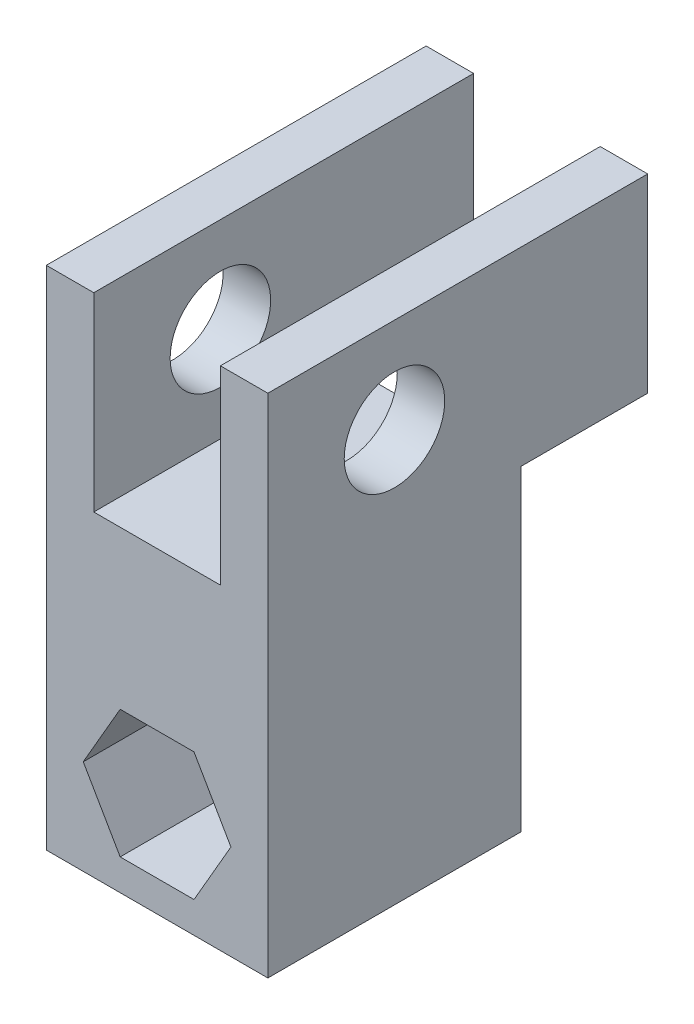
ISO-10303-21;
HEADER;
FILE_DESCRIPTION(('STEP AP214'),'2;1');
FILE_NAME('part.step','',(''),(''),'','','');
FILE_SCHEMA(('AUTOMOTIVE_DESIGN { 1 0 10303 214 1 1 1 1 }'));
ENDSEC;
DATA;
#1=APPLICATION_CONTEXT('core data for automotive mechanical design processes');
#2=APPLICATION_PROTOCOL_DEFINITION('international standard','automotive_design',2000,#1);
#3=PRODUCT_CONTEXT('',#1,'mechanical');
#4=PRODUCT('Part','Part','',(#3));
#5=PRODUCT_RELATED_PRODUCT_CATEGORY('part','',(#4));
#6=PRODUCT_DEFINITION_FORMATION('','',#4);
#7=PRODUCT_DEFINITION_CONTEXT('part definition',#1,'design');
#8=PRODUCT_DEFINITION('design','',#6,#7);
#9=PRODUCT_DEFINITION_SHAPE('','',#8);
#10=(LENGTH_UNIT() NAMED_UNIT(*) SI_UNIT(.MILLI.,.METRE.));
#11=(NAMED_UNIT(*) PLANE_ANGLE_UNIT() SI_UNIT($,.RADIAN.));
#12=(NAMED_UNIT(*) SI_UNIT($,.STERADIAN.) SOLID_ANGLE_UNIT());
#13=UNCERTAINTY_MEASURE_WITH_UNIT(LENGTH_MEASURE(1.E-05),#10,'distance_accuracy_value','');
#14=(GEOMETRIC_REPRESENTATION_CONTEXT(3) GLOBAL_UNCERTAINTY_ASSIGNED_CONTEXT((#13)) GLOBAL_UNIT_ASSIGNED_CONTEXT((#10,
#11,#12)) REPRESENTATION_CONTEXT('',''));
#15=CARTESIAN_POINT('',(0.,0.,0.));
#16=DIRECTION('',(0.,0.,1.));
#17=DIRECTION('',(1.,0.,0.));
#18=AXIS2_PLACEMENT_3D('',#15,#16,#17);
#19=CARTESIAN_POINT('',(0.,0.,0.));
#20=DIRECTION('',(0.,0.,1.));
#21=DIRECTION('',(1.,0.,0.));
#22=AXIS2_PLACEMENT_3D('',#19,#20,#21);
#23=PLANE('',#22);
#24=DIRECTION('',(0.5,0.866025403784439,0.));
#25=VECTOR('',#24,1.);
#26=CARTESIAN_POINT('',(3.70283595144767,3.11150000000001,0.));
#27=LINE('',#26,#25);
#28=CARTESIAN_POINT('',(3.70283595144767,3.11150000000001,0.));
#29=VERTEX_POINT('',#28);
#30=CARTESIAN_POINT('',(7.40567190289534,9.525,0.));
#31=VERTEX_POINT('',#30);
#32=EDGE_CURVE('E232',#29,#31,#27,.T.);
#33=ORIENTED_EDGE('',*,*,#32,.T.);
#34=DIRECTION('',(-0.5,0.866025403784439,0.));
#35=VECTOR('',#34,1.);
#36=CARTESIAN_POINT('',(7.40567190289534,9.525,0.));
#37=LINE('',#36,#35);
#38=CARTESIAN_POINT('',(3.70283595144767,15.9385,0.));
#39=VERTEX_POINT('',#38);
#40=EDGE_CURVE('E216',#31,#39,#37,.T.);
#41=ORIENTED_EDGE('',*,*,#40,.T.);
#42=DIRECTION('',(-1.,0.,0.));
#43=VECTOR('',#42,1.);
#44=CARTESIAN_POINT('',(3.70283595144767,15.9385,0.));
#45=LINE('',#44,#43);
#46=CARTESIAN_POINT('',(-3.70283595144766,15.9385,0.));
#47=VERTEX_POINT('',#46);
#48=EDGE_CURVE('E219',#39,#47,#45,.T.);
#49=ORIENTED_EDGE('',*,*,#48,.T.);
#50=DIRECTION('',(-0.5,-0.866025403784439,0.));
#51=VECTOR('',#50,1.);
#52=CARTESIAN_POINT('',(-3.70283595144766,15.9385,0.));
#53=LINE('',#52,#51);
#54=CARTESIAN_POINT('',(-7.40567190289533,9.525,0.));
#55=VERTEX_POINT('',#54);
#56=EDGE_CURVE('E223',#47,#55,#53,.T.);
#57=ORIENTED_EDGE('',*,*,#56,.T.);
#58=DIRECTION('',(0.5,-0.866025403784439,0.));
#59=VECTOR('',#58,1.);
#60=CARTESIAN_POINT('',(-7.40567190289533,9.525,0.));
#61=LINE('',#60,#59);
#62=CARTESIAN_POINT('',(-3.70283595144766,3.1115,0.));
#63=VERTEX_POINT('',#62);
#64=EDGE_CURVE('E226',#55,#63,#61,.T.);
#65=ORIENTED_EDGE('',*,*,#64,.T.);
#66=DIRECTION('',(1.,0.,0.));
#67=VECTOR('',#66,1.);
#68=CARTESIAN_POINT('',(-3.70283595144766,3.1115,0.));
#69=LINE('',#68,#67);
#70=EDGE_CURVE('E229',#63,#29,#69,.T.);
#71=ORIENTED_EDGE('',*,*,#70,.T.);
#72=EDGE_LOOP('',(#33,#41,#49,#57,#65,#71));
#73=FACE_BOUND('',#72,.T.);
#74=DIRECTION('',(-1.,0.,0.));
#75=VECTOR('',#74,1.);
#76=CARTESIAN_POINT('',(11.1125,31.75,0.));
#77=LINE('',#76,#75);
#78=CARTESIAN_POINT('',(11.1125,31.75,0.));
#79=VERTEX_POINT('',#78);
#80=CARTESIAN_POINT('',(6.34999999999999,31.75,0.));
#81=VERTEX_POINT('',#80);
#82=EDGE_CURVE('E57',#79,#81,#77,.T.);
#83=ORIENTED_EDGE('',*,*,#82,.F.);
#84=DIRECTION('',(0.,1.,0.));
#85=VECTOR('',#84,1.);
#86=CARTESIAN_POINT('',(11.1125,50.8,0.));
#87=LINE('',#86,#85);
#88=CARTESIAN_POINT('',(11.1125,0.,0.));
#89=VERTEX_POINT('',#88);
#90=EDGE_CURVE('E183',#89,#79,#87,.T.);
#91=ORIENTED_EDGE('',*,*,#90,.F.);
#92=DIRECTION('',(1.,0.,0.));
#93=VECTOR('',#92,1.);
#94=CARTESIAN_POINT('',(-11.1125,0.,0.));
#95=LINE('',#94,#93);
#96=CARTESIAN_POINT('',(-11.1125,0.,0.));
#97=VERTEX_POINT('',#96);
#98=EDGE_CURVE('E266',#97,#89,#95,.T.);
#99=ORIENTED_EDGE('',*,*,#98,.F.);
#100=DIRECTION('',(0.,-1.,0.));
#101=VECTOR('',#100,1.);
#102=CARTESIAN_POINT('',(-11.1125,0.,0.));
#103=LINE('',#102,#101);
#104=CARTESIAN_POINT('',(-11.1125,31.75,0.));
#105=VERTEX_POINT('',#104);
#106=EDGE_CURVE('E285',#105,#97,#103,.T.);
#107=ORIENTED_EDGE('',*,*,#106,.F.);
#108=DIRECTION('',(-1.,0.,0.));
#109=VECTOR('',#108,1.);
#110=CARTESIAN_POINT('',(-11.1125,31.75,0.));
#111=LINE('',#110,#109);
#112=CARTESIAN_POINT('',(-6.35000000000001,31.75,0.));
#113=VERTEX_POINT('',#112);
#114=EDGE_CURVE('E199',#113,#105,#111,.T.);
#115=ORIENTED_EDGE('',*,*,#114,.F.);
#116=DIRECTION('',(-1.,0.,0.));
#117=VECTOR('',#116,1.);
#118=CARTESIAN_POINT('',(-6.35000000000001,31.75,0.));
#119=LINE('',#118,#117);
#120=EDGE_CURVE('E282',#81,#113,#119,.T.);
#121=ORIENTED_EDGE('',*,*,#120,.F.);
#122=EDGE_LOOP('',(#83,#91,#99,#107,#115,#121));
#123=FACE_BOUND('',#122,.T.);
#124=ADVANCED_FACE('F41',(#73,#123),#23,.F.);
#125=CARTESIAN_POINT('',(-11.1125,0.,25.4));
#126=DIRECTION('',(1.,0.,0.));
#127=DIRECTION('',(0.,0.,-1.));
#128=AXIS2_PLACEMENT_3D('',#125,#126,#127);
#129=PLANE('',#128);
#130=DIRECTION('',(0.,0.,-1.));
#131=VECTOR('',#130,1.);
#132=CARTESIAN_POINT('',(-11.1125,50.8,25.4));
#133=LINE('',#132,#131);
#134=CARTESIAN_POINT('',(-11.1125,50.8,25.4));
#135=VERTEX_POINT('',#134);
#136=CARTESIAN_POINT('',(-11.1125,50.8,-12.7));
#137=VERTEX_POINT('',#136);
#138=EDGE_CURVE('E292',#135,#137,#133,.T.);
#139=ORIENTED_EDGE('',*,*,#138,.T.);
#140=DIRECTION('',(0.,1.,0.));
#141=VECTOR('',#140,1.);
#142=CARTESIAN_POINT('',(-11.1125,50.8,-12.7));
#143=LINE('',#142,#141);
#144=CARTESIAN_POINT('',(-11.1125,31.75,-12.7));
#145=VERTEX_POINT('',#144);
#146=EDGE_CURVE('E202',#145,#137,#143,.T.);
#147=ORIENTED_EDGE('',*,*,#146,.F.);
#148=DIRECTION('',(0.,0.,1.));
#149=VECTOR('',#148,1.);
#150=CARTESIAN_POINT('',(-11.1125,31.75,-12.7));
#151=LINE('',#150,#149);
#152=EDGE_CURVE('E195',#145,#105,#151,.T.);
#153=ORIENTED_EDGE('',*,*,#152,.T.);
#154=ORIENTED_EDGE('',*,*,#106,.T.);
#155=DIRECTION('',(0.,0.,-1.));
#156=VECTOR('',#155,1.);
#157=CARTESIAN_POINT('',(-11.1125,0.,25.4));
#158=LINE('',#157,#156);
#159=CARTESIAN_POINT('',(-11.1125,0.,25.4));
#160=VERTEX_POINT('',#159);
#161=EDGE_CURVE('E289',#160,#97,#158,.T.);
#162=ORIENTED_EDGE('',*,*,#161,.F.);
#163=DIRECTION('',(0.,-1.,0.));
#164=VECTOR('',#163,1.);
#165=CARTESIAN_POINT('',(-11.1125,0.,25.4));
#166=LINE('',#165,#164);
#167=EDGE_CURVE('E276',#135,#160,#166,.T.);
#168=ORIENTED_EDGE('',*,*,#167,.F.);
#169=EDGE_LOOP('',(#139,#147,#153,#154,#162,#168));
#170=FACE_BOUND('',#169,.T.);
#171=CARTESIAN_POINT('',(-11.1125,41.275,12.7));
#172=DIRECTION('',(-1.,0.,0.));
#173=DIRECTION('',(0.,0.,1.));
#174=AXIS2_PLACEMENT_3D('',#171,#172,#173);
#175=CIRCLE('',#174,5.0419);
#176=CARTESIAN_POINT('',(-11.1125,41.275,17.7419));
#177=VERTEX_POINT('',#176);
#178=EDGE_CURVE('E184',#177,#177,#175,.T.);
#179=ORIENTED_EDGE('',*,*,#178,.F.);
#180=EDGE_LOOP('',(#179));
#181=FACE_BOUND('',#180,.T.);
#182=ADVANCED_FACE('F328',(#170,#181),#129,.F.);
#183=CARTESIAN_POINT('',(11.1125,50.8,25.4));
#184=DIRECTION('',(-1.,0.,0.));
#185=DIRECTION('',(0.,-1.,0.));
#186=AXIS2_PLACEMENT_3D('',#183,#184,#185);
#187=PLANE('',#186);
#188=CARTESIAN_POINT('',(11.1125,41.275,12.7));
#189=DIRECTION('',(-1.,0.,0.));
#190=DIRECTION('',(0.,0.,1.));
#191=AXIS2_PLACEMENT_3D('',#188,#189,#190);
#192=CIRCLE('',#191,5.04189999999999);
#193=CARTESIAN_POINT('',(11.1125,41.275,17.7419));
#194=VERTEX_POINT('',#193);
#195=EDGE_CURVE('E187',#194,#194,#192,.T.);
#196=ORIENTED_EDGE('',*,*,#195,.T.);
#197=EDGE_LOOP('',(#196));
#198=FACE_BOUND('',#197,.T.);
#199=ORIENTED_EDGE('',*,*,#90,.T.);
#200=DIRECTION('',(0.,0.,1.));
#201=VECTOR('',#200,1.);
#202=CARTESIAN_POINT('',(11.1125,31.75,-12.7));
#203=LINE('',#202,#201);
#204=CARTESIAN_POINT('',(11.1125,31.75,-12.7));
#205=VERTEX_POINT('',#204);
#206=EDGE_CURVE('E165',#205,#79,#203,.T.);
#207=ORIENTED_EDGE('',*,*,#206,.F.);
#208=DIRECTION('',(0.,-1.,0.));
#209=VECTOR('',#208,1.);
#210=CARTESIAN_POINT('',(11.1125,50.8,-12.7));
#211=LINE('',#210,#209);
#212=CARTESIAN_POINT('',(11.1125,50.8,-12.7));
#213=VERTEX_POINT('',#212);
#214=EDGE_CURVE('E172',#213,#205,#211,.T.);
#215=ORIENTED_EDGE('',*,*,#214,.F.);
#216=DIRECTION('',(0.,0.,-1.));
#217=VECTOR('',#216,1.);
#218=CARTESIAN_POINT('',(11.1125,50.8,25.4));
#219=LINE('',#218,#217);
#220=CARTESIAN_POINT('',(11.1125,50.8,25.4));
#221=VERTEX_POINT('',#220);
#222=EDGE_CURVE('E11',#221,#213,#219,.T.);
#223=ORIENTED_EDGE('',*,*,#222,.F.);
#224=DIRECTION('',(0.,1.,0.));
#225=VECTOR('',#224,1.);
#226=CARTESIAN_POINT('',(11.1125,50.8,25.4));
#227=LINE('',#226,#225);
#228=CARTESIAN_POINT('',(11.1125,0.,25.4));
#229=VERTEX_POINT('',#228);
#230=EDGE_CURVE('E262',#229,#221,#227,.T.);
#231=ORIENTED_EDGE('',*,*,#230,.F.);
#232=DIRECTION('',(0.,0.,-1.));
#233=VECTOR('',#232,1.);
#234=CARTESIAN_POINT('',(11.1125,0.,25.4));
#235=LINE('',#234,#233);
#236=EDGE_CURVE('E280',#229,#89,#235,.T.);
#237=ORIENTED_EDGE('',*,*,#236,.T.);
#238=EDGE_LOOP('',(#199,#207,#215,#223,#231,#237));
#239=FACE_BOUND('',#238,.T.);
#240=ADVANCED_FACE('F43',(#198,#239),#187,.F.);
#241=CARTESIAN_POINT('',(6.34999999999999,50.8,25.4));
#242=DIRECTION('',(0.,-1.,0.));
#243=DIRECTION('',(1.,0.,0.));
#244=AXIS2_PLACEMENT_3D('',#241,#242,#243);
#245=PLANE('',#244);
#246=ORIENTED_EDGE('',*,*,#222,.T.);
#247=DIRECTION('',(1.,0.,0.));
#248=VECTOR('',#247,1.);
#249=CARTESIAN_POINT('',(11.1125,50.8,-12.7));
#250=LINE('',#249,#248);
#251=CARTESIAN_POINT('',(6.35,50.8,-12.7));
#252=VERTEX_POINT('',#251);
#253=EDGE_CURVE('E178',#252,#213,#250,.T.);
#254=ORIENTED_EDGE('',*,*,#253,.F.);
#255=DIRECTION('',(0.,0.,-1.));
#256=VECTOR('',#255,1.);
#257=CARTESIAN_POINT('',(6.34999999999999,50.8,25.4));
#258=LINE('',#257,#256);
#259=CARTESIAN_POINT('',(6.34999999999999,50.8,25.4));
#260=VERTEX_POINT('',#259);
#261=EDGE_CURVE('E50',#260,#252,#258,.T.);
#262=ORIENTED_EDGE('',*,*,#261,.F.);
#263=DIRECTION('',(-1.,0.,0.));
#264=VECTOR('',#263,1.);
#265=CARTESIAN_POINT('',(6.34999999999999,50.8,25.4));
#266=LINE('',#265,#264);
#267=EDGE_CURVE('E265',#221,#260,#266,.T.);
#268=ORIENTED_EDGE('',*,*,#267,.F.);
#269=EDGE_LOOP('',(#246,#254,#262,#268));
#270=FACE_BOUND('',#269,.T.);
#271=ADVANCED_FACE('F309',(#270),#245,.F.);
#272=CARTESIAN_POINT('',(6.34999999999999,31.75,25.4));
#273=DIRECTION('',(1.,0.,0.));
#274=DIRECTION('',(0.,0.,-1.));
#275=AXIS2_PLACEMENT_3D('',#272,#273,#274);
#276=PLANE('',#275);
#277=CARTESIAN_POINT('',(6.34999999999999,41.275,12.7));
#278=DIRECTION('',(1.,0.,0.));
#279=DIRECTION('',(0.,0.,-1.));
#280=AXIS2_PLACEMENT_3D('',#277,#278,#279);
#281=CIRCLE('',#280,5.0419);
#282=CARTESIAN_POINT('',(6.34999999999999,41.275,7.6581));
#283=VERTEX_POINT('',#282);
#284=EDGE_CURVE('E213',#283,#283,#281,.T.);
#285=ORIENTED_EDGE('',*,*,#284,.T.);
#286=EDGE_LOOP('',(#285));
#287=FACE_BOUND('',#286,.T.);
#288=ORIENTED_EDGE('',*,*,#261,.T.);
#289=DIRECTION('',(0.,1.,0.));
#290=VECTOR('',#289,1.);
#291=CARTESIAN_POINT('',(6.35,50.8,-12.7));
#292=LINE('',#291,#290);
#293=CARTESIAN_POINT('',(6.34999999999999,31.75,-12.7));
#294=VERTEX_POINT('',#293);
#295=EDGE_CURVE('E171',#294,#252,#292,.T.);
#296=ORIENTED_EDGE('',*,*,#295,.F.);
#297=DIRECTION('',(0.,0.,1.));
#298=VECTOR('',#297,1.);
#299=CARTESIAN_POINT('',(6.34999999999999,31.75,-12.7));
#300=LINE('',#299,#298);
#301=EDGE_CURVE('E167',#294,#81,#300,.T.);
#302=ORIENTED_EDGE('',*,*,#301,.T.);
#303=DIRECTION('',(0.,0.,-1.));
#304=VECTOR('',#303,1.);
#305=CARTESIAN_POINT('',(6.34999999999999,31.75,25.4));
#306=LINE('',#305,#304);
#307=CARTESIAN_POINT('',(6.34999999999999,31.75,25.4));
#308=VERTEX_POINT('',#307);
#309=EDGE_CURVE('E299',#308,#81,#306,.T.);
#310=ORIENTED_EDGE('',*,*,#309,.F.);
#311=DIRECTION('',(0.,-1.,0.));
#312=VECTOR('',#311,1.);
#313=CARTESIAN_POINT('',(6.34999999999999,31.75,25.4));
#314=LINE('',#313,#312);
#315=EDGE_CURVE('E268',#260,#308,#314,.T.);
#316=ORIENTED_EDGE('',*,*,#315,.F.);
#317=EDGE_LOOP('',(#288,#296,#302,#310,#316));
#318=FACE_BOUND('',#317,.T.);
#319=ADVANCED_FACE('F305',(#287,#318),#276,.F.);
#320=CARTESIAN_POINT('',(-6.35000000000001,31.75,25.4));
#321=DIRECTION('',(0.,-1.,0.));
#322=DIRECTION('',(0.,0.,-1.));
#323=AXIS2_PLACEMENT_3D('',#320,#321,#322);
#324=PLANE('',#323);
#325=ORIENTED_EDGE('',*,*,#120,.T.);
#326=DIRECTION('',(0.,0.,-1.));
#327=VECTOR('',#326,1.);
#328=CARTESIAN_POINT('',(-6.35000000000001,31.75,25.4));
#329=LINE('',#328,#327);
#330=CARTESIAN_POINT('',(-6.35000000000001,31.75,25.4));
#331=VERTEX_POINT('',#330);
#332=EDGE_CURVE('E296',#331,#113,#329,.T.);
#333=ORIENTED_EDGE('',*,*,#332,.F.);
#334=DIRECTION('',(-1.,0.,0.));
#335=VECTOR('',#334,1.);
#336=CARTESIAN_POINT('',(-6.35000000000001,31.75,25.4));
#337=LINE('',#336,#335);
#338=EDGE_CURVE('E270',#308,#331,#337,.T.);
#339=ORIENTED_EDGE('',*,*,#338,.F.);
#340=ORIENTED_EDGE('',*,*,#309,.T.);
#341=EDGE_LOOP('',(#325,#333,#339,#340));
#342=FACE_BOUND('',#341,.T.);
#343=ADVANCED_FACE('F314',(#342),#324,.F.);
#344=CARTESIAN_POINT('',(-6.35000000000001,50.8,25.4));
#345=DIRECTION('',(-1.,0.,0.));
#346=DIRECTION('',(0.,-1.,0.));
#347=AXIS2_PLACEMENT_3D('',#344,#345,#346);
#348=PLANE('',#347);
#349=CARTESIAN_POINT('',(-6.35000000000001,41.275,12.7));
#350=DIRECTION('',(-1.,0.,0.));
#351=DIRECTION('',(0.,-1.,0.));
#352=AXIS2_PLACEMENT_3D('',#349,#350,#351);
#353=CIRCLE('',#352,5.0419);
#354=CARTESIAN_POINT('',(-6.35000000000001,36.2331,12.7));
#355=VERTEX_POINT('',#354);
#356=EDGE_CURVE('E45',#355,#355,#353,.T.);
#357=ORIENTED_EDGE('',*,*,#356,.T.);
#358=EDGE_LOOP('',(#357));
#359=FACE_BOUND('',#358,.T.);
#360=ORIENTED_EDGE('',*,*,#332,.T.);
#361=DIRECTION('',(0.,0.,1.));
#362=VECTOR('',#361,1.);
#363=CARTESIAN_POINT('',(-6.35000000000001,31.75,-12.7));
#364=LINE('',#363,#362);
#365=CARTESIAN_POINT('',(-6.35000000000001,31.75,-12.7));
#366=VERTEX_POINT('',#365);
#367=EDGE_CURVE('E192',#366,#113,#364,.T.);
#368=ORIENTED_EDGE('',*,*,#367,.F.);
#369=DIRECTION('',(0.,-1.,0.));
#370=VECTOR('',#369,1.);
#371=CARTESIAN_POINT('',(-6.35,50.8,-12.7));
#372=LINE('',#371,#370);
#373=CARTESIAN_POINT('',(-6.35,50.8,-12.7));
#374=VERTEX_POINT('',#373);
#375=EDGE_CURVE('E204',#374,#366,#372,.T.);
#376=ORIENTED_EDGE('',*,*,#375,.F.);
#377=DIRECTION('',(0.,0.,-1.));
#378=VECTOR('',#377,1.);
#379=CARTESIAN_POINT('',(-6.35000000000001,50.8,25.4));
#380=LINE('',#379,#378);
#381=CARTESIAN_POINT('',(-6.35000000000001,50.8,25.4));
#382=VERTEX_POINT('',#381);
#383=EDGE_CURVE('E294',#382,#374,#380,.T.);
#384=ORIENTED_EDGE('',*,*,#383,.F.);
#385=DIRECTION('',(0.,1.,0.));
#386=VECTOR('',#385,1.);
#387=CARTESIAN_POINT('',(-6.35000000000001,50.8,25.4));
#388=LINE('',#387,#386);
#389=EDGE_CURVE('E272',#331,#382,#388,.T.);
#390=ORIENTED_EDGE('',*,*,#389,.F.);
#391=EDGE_LOOP('',(#360,#368,#376,#384,#390));
#392=FACE_BOUND('',#391,.T.);
#393=ADVANCED_FACE('F337',(#359,#392),#348,.F.);
#394=CARTESIAN_POINT('',(-11.1125,50.8,25.4));
#395=DIRECTION('',(0.,-1.,0.));
#396=DIRECTION('',(0.,0.,-1.));
#397=AXIS2_PLACEMENT_3D('',#394,#395,#396);
#398=PLANE('',#397);
#399=ORIENTED_EDGE('',*,*,#383,.T.);
#400=DIRECTION('',(1.,0.,0.));
#401=VECTOR('',#400,1.);
#402=CARTESIAN_POINT('',(-11.1125,50.8,-12.7));
#403=LINE('',#402,#401);
#404=EDGE_CURVE('E206',#137,#374,#403,.T.);
#405=ORIENTED_EDGE('',*,*,#404,.F.);
#406=ORIENTED_EDGE('',*,*,#138,.F.);
#407=DIRECTION('',(-1.,0.,0.));
#408=VECTOR('',#407,1.);
#409=CARTESIAN_POINT('',(-11.1125,50.8,25.4));
#410=LINE('',#409,#408);
#411=EDGE_CURVE('E274',#382,#135,#410,.T.);
#412=ORIENTED_EDGE('',*,*,#411,.F.);
#413=EDGE_LOOP('',(#399,#405,#406,#412));
#414=FACE_BOUND('',#413,.T.);
#415=ADVANCED_FACE('F343',(#414),#398,.F.);
#416=CARTESIAN_POINT('',(-11.1125,0.,25.4));
#417=DIRECTION('',(0.,1.,0.));
#418=DIRECTION('',(-1.,0.,0.));
#419=AXIS2_PLACEMENT_3D('',#416,#417,#418);
#420=PLANE('',#419);
#421=ORIENTED_EDGE('',*,*,#98,.T.);
#422=ORIENTED_EDGE('',*,*,#236,.F.);
#423=DIRECTION('',(1.,0.,0.));
#424=VECTOR('',#423,1.);
#425=CARTESIAN_POINT('',(-11.1125,0.,25.4));
#426=LINE('',#425,#424);
#427=EDGE_CURVE('E278',#160,#229,#426,.T.);
#428=ORIENTED_EDGE('',*,*,#427,.F.);
#429=ORIENTED_EDGE('',*,*,#161,.T.);
#430=EDGE_LOOP('',(#421,#422,#428,#429));
#431=FACE_BOUND('',#430,.T.);
#432=ADVANCED_FACE('F324',(#431),#420,.F.);
#433=CARTESIAN_POINT('',(0.,0.,25.4));
#434=DIRECTION('',(0.,0.,1.));
#435=DIRECTION('',(1.,0.,0.));
#436=AXIS2_PLACEMENT_3D('',#433,#434,#435);
#437=PLANE('',#436);
#438=DIRECTION('',(-0.5,0.866025403784439,0.));
#439=VECTOR('',#438,1.);
#440=CARTESIAN_POINT('',(7.40567190289534,9.525,25.4));
#441=LINE('',#440,#439);
#442=CARTESIAN_POINT('',(7.40567190289534,9.525,25.4));
#443=VERTEX_POINT('',#442);
#444=CARTESIAN_POINT('',(3.70283595144767,15.9385,25.4));
#445=VERTEX_POINT('',#444);
#446=EDGE_CURVE('E65',#443,#445,#441,.T.);
#447=ORIENTED_EDGE('',*,*,#446,.F.);
#448=DIRECTION('',(0.5,0.866025403784439,0.));
#449=VECTOR('',#448,1.);
#450=CARTESIAN_POINT('',(3.70283595144767,3.11150000000001,25.4));
#451=LINE('',#450,#449);
#452=CARTESIAN_POINT('',(3.70283595144767,3.11150000000001,25.4));
#453=VERTEX_POINT('',#452);
#454=EDGE_CURVE('E220',#453,#443,#451,.T.);
#455=ORIENTED_EDGE('',*,*,#454,.F.);
#456=DIRECTION('',(1.,0.,0.));
#457=VECTOR('',#456,1.);
#458=CARTESIAN_POINT('',(-3.70283595144766,3.1115,25.4));
#459=LINE('',#458,#457);
#460=CARTESIAN_POINT('',(-3.70283595144766,3.1115,25.4));
#461=VERTEX_POINT('',#460);
#462=EDGE_CURVE('E246',#461,#453,#459,.T.);
#463=ORIENTED_EDGE('',*,*,#462,.F.);
#464=DIRECTION('',(0.5,-0.866025403784439,0.));
#465=VECTOR('',#464,1.);
#466=CARTESIAN_POINT('',(-7.40567190289533,9.525,25.4));
#467=LINE('',#466,#465);
#468=CARTESIAN_POINT('',(-7.40567190289533,9.525,25.4));
#469=VERTEX_POINT('',#468);
#470=EDGE_CURVE('E243',#469,#461,#467,.T.);
#471=ORIENTED_EDGE('',*,*,#470,.F.);
#472=DIRECTION('',(-0.5,-0.866025403784439,0.));
#473=VECTOR('',#472,1.);
#474=CARTESIAN_POINT('',(-3.70283595144766,15.9385,25.4));
#475=LINE('',#474,#473);
#476=CARTESIAN_POINT('',(-3.70283595144766,15.9385,25.4));
#477=VERTEX_POINT('',#476);
#478=EDGE_CURVE('E240',#477,#469,#475,.T.);
#479=ORIENTED_EDGE('',*,*,#478,.F.);
#480=DIRECTION('',(-1.,0.,0.));
#481=VECTOR('',#480,1.);
#482=CARTESIAN_POINT('',(3.70283595144767,15.9385,25.4));
#483=LINE('',#482,#481);
#484=EDGE_CURVE('E237',#445,#477,#483,.T.);
#485=ORIENTED_EDGE('',*,*,#484,.F.);
#486=EDGE_LOOP('',(#447,#455,#463,#471,#479,#485));
#487=FACE_BOUND('',#486,.T.);
#488=ORIENTED_EDGE('',*,*,#230,.T.);
#489=ORIENTED_EDGE('',*,*,#267,.T.);
#490=ORIENTED_EDGE('',*,*,#315,.T.);
#491=ORIENTED_EDGE('',*,*,#338,.T.);
#492=ORIENTED_EDGE('',*,*,#389,.T.);
#493=ORIENTED_EDGE('',*,*,#411,.T.);
#494=ORIENTED_EDGE('',*,*,#167,.T.);
#495=ORIENTED_EDGE('',*,*,#427,.T.);
#496=EDGE_LOOP('',(#488,#489,#490,#491,#492,#493,#494,#495));
#497=FACE_BOUND('',#496,.T.);
#498=ADVANCED_FACE('F317',(#487,#497),#437,.T.);
#499=CARTESIAN_POINT('',(7.40567190289534,9.525,0.));
#500=DIRECTION('',(0.866025403784439,0.5,0.));
#501=DIRECTION('',(-0.5,0.866025403784439,0.));
#502=AXIS2_PLACEMENT_3D('',#499,#500,#501);
#503=PLANE('',#502);
#504=ORIENTED_EDGE('',*,*,#446,.T.);
#505=DIRECTION('',(0.,0.,1.));
#506=VECTOR('',#505,1.);
#507=CARTESIAN_POINT('',(3.70283595144767,15.9385,0.));
#508=LINE('',#507,#506);
#509=EDGE_CURVE('E235',#39,#445,#508,.T.);
#510=ORIENTED_EDGE('',*,*,#509,.F.);
#511=ORIENTED_EDGE('',*,*,#40,.F.);
#512=DIRECTION('',(0.,0.,1.));
#513=VECTOR('',#512,1.);
#514=CARTESIAN_POINT('',(7.40567190289534,9.525,0.));
#515=LINE('',#514,#513);
#516=EDGE_CURVE('E251',#31,#443,#515,.T.);
#517=ORIENTED_EDGE('',*,*,#516,.T.);
#518=EDGE_LOOP('',(#504,#510,#511,#517));
#519=FACE_BOUND('',#518,.T.);
#520=ADVANCED_FACE('F400',(#519),#503,.F.);
#521=CARTESIAN_POINT('',(3.70283595144767,3.11150000000001,0.));
#522=DIRECTION('',(0.866025403784439,-0.5,0.));
#523=DIRECTION('',(0.5,0.866025403784439,0.));
#524=AXIS2_PLACEMENT_3D('',#521,#522,#523);
#525=PLANE('',#524);
#526=ORIENTED_EDGE('',*,*,#454,.T.);
#527=ORIENTED_EDGE('',*,*,#516,.F.);
#528=ORIENTED_EDGE('',*,*,#32,.F.);
#529=DIRECTION('',(0.,0.,1.));
#530=VECTOR('',#529,1.);
#531=CARTESIAN_POINT('',(3.70283595144767,3.11150000000001,0.));
#532=LINE('',#531,#530);
#533=EDGE_CURVE('E253',#29,#453,#532,.T.);
#534=ORIENTED_EDGE('',*,*,#533,.T.);
#535=EDGE_LOOP('',(#526,#527,#528,#534));
#536=FACE_BOUND('',#535,.T.);
#537=ADVANCED_FACE('F396',(#536),#525,.F.);
#538=CARTESIAN_POINT('',(-3.70283595144766,3.1115,0.));
#539=DIRECTION('',(0.,-1.,0.));
#540=DIRECTION('',(1.,0.,0.));
#541=AXIS2_PLACEMENT_3D('',#538,#539,#540);
#542=PLANE('',#541);
#543=ORIENTED_EDGE('',*,*,#462,.T.);
#544=ORIENTED_EDGE('',*,*,#533,.F.);
#545=ORIENTED_EDGE('',*,*,#70,.F.);
#546=DIRECTION('',(0.,0.,1.));
#547=VECTOR('',#546,1.);
#548=CARTESIAN_POINT('',(-3.70283595144766,3.1115,0.));
#549=LINE('',#548,#547);
#550=EDGE_CURVE('E255',#63,#461,#549,.T.);
#551=ORIENTED_EDGE('',*,*,#550,.T.);
#552=EDGE_LOOP('',(#543,#544,#545,#551));
#553=FACE_BOUND('',#552,.T.);
#554=ADVANCED_FACE('F399',(#553),#542,.F.);
#555=CARTESIAN_POINT('',(-7.40567190289533,9.525,0.));
#556=DIRECTION('',(-0.866025403784439,-0.5,0.));
#557=DIRECTION('',(0.5,-0.866025403784439,0.));
#558=AXIS2_PLACEMENT_3D('',#555,#556,#557);
#559=PLANE('',#558);
#560=ORIENTED_EDGE('',*,*,#470,.T.);
#561=ORIENTED_EDGE('',*,*,#550,.F.);
#562=ORIENTED_EDGE('',*,*,#64,.F.);
#563=DIRECTION('',(0.,0.,1.));
#564=VECTOR('',#563,1.);
#565=CARTESIAN_POINT('',(-7.40567190289533,9.525,0.));
#566=LINE('',#565,#564);
#567=EDGE_CURVE('E257',#55,#469,#566,.T.);
#568=ORIENTED_EDGE('',*,*,#567,.T.);
#569=EDGE_LOOP('',(#560,#561,#562,#568));
#570=FACE_BOUND('',#569,.T.);
#571=ADVANCED_FACE('F404',(#570),#559,.F.);
#572=CARTESIAN_POINT('',(-3.70283595144766,15.9385,0.));
#573=DIRECTION('',(-0.866025403784439,0.5,0.));
#574=DIRECTION('',(-0.5,-0.866025403784439,0.));
#575=AXIS2_PLACEMENT_3D('',#572,#573,#574);
#576=PLANE('',#575);
#577=ORIENTED_EDGE('',*,*,#478,.T.);
#578=ORIENTED_EDGE('',*,*,#567,.F.);
#579=ORIENTED_EDGE('',*,*,#56,.F.);
#580=DIRECTION('',(0.,0.,1.));
#581=VECTOR('',#580,1.);
#582=CARTESIAN_POINT('',(-3.70283595144766,15.9385,0.));
#583=LINE('',#582,#581);
#584=EDGE_CURVE('E259',#47,#477,#583,.T.);
#585=ORIENTED_EDGE('',*,*,#584,.T.);
#586=EDGE_LOOP('',(#577,#578,#579,#585));
#587=FACE_BOUND('',#586,.T.);
#588=ADVANCED_FACE('F408',(#587),#576,.F.);
#589=CARTESIAN_POINT('',(3.70283595144767,15.9385,0.));
#590=DIRECTION('',(0.,1.,0.));
#591=DIRECTION('',(0.,0.,1.));
#592=AXIS2_PLACEMENT_3D('',#589,#590,#591);
#593=PLANE('',#592);
#594=ORIENTED_EDGE('',*,*,#484,.T.);
#595=ORIENTED_EDGE('',*,*,#584,.F.);
#596=ORIENTED_EDGE('',*,*,#48,.F.);
#597=ORIENTED_EDGE('',*,*,#509,.T.);
#598=EDGE_LOOP('',(#594,#595,#596,#597));
#599=FACE_BOUND('',#598,.T.);
#600=ADVANCED_FACE('F393',(#599),#593,.F.);
#601=CARTESIAN_POINT('',(-11.1125,41.275,12.7));
#602=DIRECTION('',(-1.,0.,0.));
#603=DIRECTION('',(0.,0.,1.));
#604=AXIS2_PLACEMENT_3D('',#601,#602,#603);
#605=CYLINDRICAL_SURFACE('',#604,5.0419);
#606=ORIENTED_EDGE('',*,*,#178,.T.);
#607=EDGE_LOOP('',(#606));
#608=FACE_BOUND('',#607,.T.);
#609=ORIENTED_EDGE('',*,*,#356,.F.);
#610=EDGE_LOOP('',(#609));
#611=FACE_BOUND('',#610,.T.);
#612=ADVANCED_FACE('F388',(#608,#611),#605,.F.);
#613=ORIENTED_EDGE('',*,*,#195,.F.);
#614=EDGE_LOOP('',(#613));
#615=FACE_BOUND('',#614,.T.);
#616=ORIENTED_EDGE('',*,*,#284,.F.);
#617=EDGE_LOOP('',(#616));
#618=FACE_BOUND('',#617,.T.);
#619=ADVANCED_FACE('F353',(#615,#618),#605,.F.);
#620=CARTESIAN_POINT('',(-11.1125,31.75,-12.7));
#621=DIRECTION('',(0.,1.,0.));
#622=DIRECTION('',(0.,0.,1.));
#623=AXIS2_PLACEMENT_3D('',#620,#621,#622);
#624=PLANE('',#623);
#625=ORIENTED_EDGE('',*,*,#114,.T.);
#626=ORIENTED_EDGE('',*,*,#152,.F.);
#627=DIRECTION('',(-1.,0.,0.));
#628=VECTOR('',#627,1.);
#629=CARTESIAN_POINT('',(-11.1125,31.75,-12.7));
#630=LINE('',#629,#628);
#631=EDGE_CURVE('E198',#366,#145,#630,.T.);
#632=ORIENTED_EDGE('',*,*,#631,.F.);
#633=ORIENTED_EDGE('',*,*,#367,.T.);
#634=EDGE_LOOP('',(#625,#626,#632,#633));
#635=FACE_BOUND('',#634,.T.);
#636=ADVANCED_FACE('F334',(#635),#624,.F.);
#637=CARTESIAN_POINT('',(0.,0.,-12.7));
#638=DIRECTION('',(0.,0.,1.));
#639=DIRECTION('',(1.,0.,0.));
#640=AXIS2_PLACEMENT_3D('',#637,#638,#639);
#641=PLANE('',#640);
#642=ORIENTED_EDGE('',*,*,#146,.T.);
#643=ORIENTED_EDGE('',*,*,#404,.T.);
#644=ORIENTED_EDGE('',*,*,#375,.T.);
#645=ORIENTED_EDGE('',*,*,#631,.T.);
#646=EDGE_LOOP('',(#642,#643,#644,#645));
#647=FACE_BOUND('',#646,.T.);
#648=ADVANCED_FACE('F345',(#647),#641,.F.);
#649=CARTESIAN_POINT('',(11.1125,31.75,-12.7));
#650=DIRECTION('',(0.,1.,0.));
#651=DIRECTION('',(0.,0.,1.));
#652=AXIS2_PLACEMENT_3D('',#649,#650,#651);
#653=PLANE('',#652);
#654=ORIENTED_EDGE('',*,*,#82,.T.);
#655=ORIENTED_EDGE('',*,*,#301,.F.);
#656=DIRECTION('',(-1.,0.,0.));
#657=VECTOR('',#656,1.);
#658=CARTESIAN_POINT('',(11.1125,31.75,-12.7));
#659=LINE('',#658,#657);
#660=EDGE_CURVE('E161',#205,#294,#659,.T.);
#661=ORIENTED_EDGE('',*,*,#660,.F.);
#662=ORIENTED_EDGE('',*,*,#206,.T.);
#663=EDGE_LOOP('',(#654,#655,#661,#662));
#664=FACE_BOUND('',#663,.T.);
#665=ADVANCED_FACE('F163',(#664),#653,.F.);
#666=CARTESIAN_POINT('',(0.,0.,-12.7));
#667=DIRECTION('',(0.,0.,-1.));
#668=DIRECTION('',(-1.,0.,0.));
#669=AXIS2_PLACEMENT_3D('',#666,#667,#668);
#670=PLANE('',#669);
#671=ORIENTED_EDGE('',*,*,#214,.T.);
#672=ORIENTED_EDGE('',*,*,#660,.T.);
#673=ORIENTED_EDGE('',*,*,#295,.T.);
#674=ORIENTED_EDGE('',*,*,#253,.T.);
#675=EDGE_LOOP('',(#671,#672,#673,#674));
#676=FACE_BOUND('',#675,.T.);
#677=ADVANCED_FACE('F176',(#676),#670,.T.);
#678=CLOSED_SHELL('',(#124,#182,#240,#271,#319,#343,#393,#415,#432,#498,#520,#537,#554,#571,
#588,#600,#612,#619,#636,#648,#665,#677));
#679=MANIFOLD_SOLID_BREP('B2',#678);
#680=ADVANCED_BREP_SHAPE_REPRESENTATION('',(#18,#679),#14);
#681=SHAPE_DEFINITION_REPRESENTATION(#9,#680);
ENDSEC;
END-ISO-10303-21;
